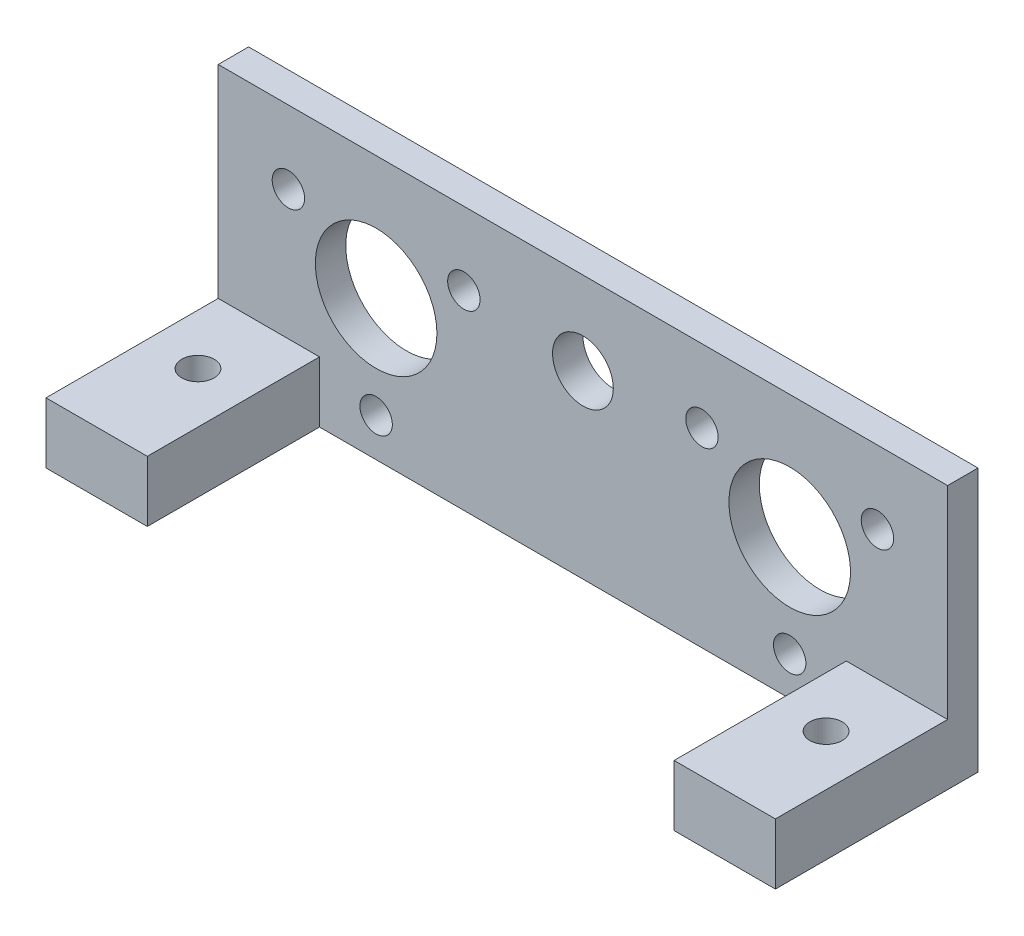
ISO-10303-21;
HEADER;
FILE_DESCRIPTION(('STEP AP214'),'2;1');
FILE_NAME('part.step','',(''),(''),'','','');
FILE_SCHEMA(('AUTOMOTIVE_DESIGN { 1 0 10303 214 1 1 1 1 }'));
ENDSEC;
DATA;
#1=APPLICATION_CONTEXT('core data for automotive mechanical design processes');
#2=APPLICATION_PROTOCOL_DEFINITION('international standard','automotive_design',2000,#1);
#3=PRODUCT_CONTEXT('',#1,'mechanical');
#4=PRODUCT('Part','Part','',(#3));
#5=PRODUCT_RELATED_PRODUCT_CATEGORY('part','',(#4));
#6=PRODUCT_DEFINITION_FORMATION('','',#4);
#7=PRODUCT_DEFINITION_CONTEXT('part definition',#1,'design');
#8=PRODUCT_DEFINITION('design','',#6,#7);
#9=PRODUCT_DEFINITION_SHAPE('','',#8);
#10=(LENGTH_UNIT() NAMED_UNIT(*) SI_UNIT(.MILLI.,.METRE.));
#11=(NAMED_UNIT(*) PLANE_ANGLE_UNIT() SI_UNIT($,.RADIAN.));
#12=(NAMED_UNIT(*) SI_UNIT($,.STERADIAN.) SOLID_ANGLE_UNIT());
#13=UNCERTAINTY_MEASURE_WITH_UNIT(LENGTH_MEASURE(1.E-05),#10,'distance_accuracy_value','');
#14=(GEOMETRIC_REPRESENTATION_CONTEXT(3) GLOBAL_UNCERTAINTY_ASSIGNED_CONTEXT((#13)) GLOBAL_UNIT_ASSIGNED_CONTEXT((#10,
#11,#12)) REPRESENTATION_CONTEXT('',''));
#15=CARTESIAN_POINT('',(0.,0.,0.));
#16=DIRECTION('',(0.,0.,1.));
#17=DIRECTION('',(1.,0.,0.));
#18=AXIS2_PLACEMENT_3D('',#15,#16,#17);
#19=CARTESIAN_POINT('',(-17.9999999961348,4.1,1.5));
#20=DIRECTION('',(0.,0.,-1.));
#21=DIRECTION('',(-1.,0.,0.));
#22=AXIS2_PLACEMENT_3D('',#19,#20,#21);
#23=PLANE('',#22);
#24=CARTESIAN_POINT('',(10.2058806538652,-2.00000000115367,1.5));
#25=DIRECTION('',(0.,0.,1.));
#26=DIRECTION('',(-1.,0.,0.));
#27=AXIS2_PLACEMENT_3D('',#24,#25,#26);
#28=CIRCLE('',#27,2.99999999663328);
#29=CARTESIAN_POINT('',(7.20588065723192,-2.00000000115367,1.5));
#30=VERTEX_POINT('',#29);
#31=EDGE_CURVE('E258',#30,#30,#28,.T.);
#32=ORIENTED_EDGE('',*,*,#31,.F.);
#33=EDGE_LOOP('',(#32));
#34=FACE_BOUND('',#33,.T.);
#35=CARTESIAN_POINT('',(5.87575363564619,0.499999998440345,1.5));
#36=DIRECTION('',(0.,0.,1.));
#37=DIRECTION('',(-1.,0.,0.));
#38=AXIS2_PLACEMENT_3D('',#35,#36,#37);
#39=CIRCLE('',#38,0.799999997424435);
#40=CARTESIAN_POINT('',(5.07575363822175,0.499999998440345,1.5));
#41=VERTEX_POINT('',#40);
#42=EDGE_CURVE('E246',#41,#41,#39,.T.);
#43=ORIENTED_EDGE('',*,*,#42,.F.);
#44=EDGE_LOOP('',(#43));
#45=FACE_BOUND('',#44,.T.);
#46=CARTESIAN_POINT('',(-1.13480579100322E-09,0.,1.5));
#47=DIRECTION('',(0.,0.,1.));
#48=DIRECTION('',(1.,0.,0.));
#49=AXIS2_PLACEMENT_3D('',#46,#47,#48);
#50=CIRCLE('',#49,1.50000000050074);
#51=CARTESIAN_POINT('',(1.49999999936594,0.,1.5));
#52=VERTEX_POINT('',#51);
#53=EDGE_CURVE('E234',#52,#52,#50,.T.);
#54=ORIENTED_EDGE('',*,*,#53,.F.);
#55=EDGE_LOOP('',(#54));
#56=FACE_BOUND('',#55,.T.);
#57=CARTESIAN_POINT('',(-5.8757536379158,0.499999998440343,1.5));
#58=DIRECTION('',(0.,0.,1.));
#59=DIRECTION('',(1.,0.,0.));
#60=AXIS2_PLACEMENT_3D('',#57,#58,#59);
#61=CIRCLE('',#60,0.799999999594875);
#62=CARTESIAN_POINT('',(-5.07575363832092,0.499999998440343,1.5));
#63=VERTEX_POINT('',#62);
#64=EDGE_CURVE('E222',#63,#63,#61,.T.);
#65=ORIENTED_EDGE('',*,*,#64,.F.);
#66=EDGE_LOOP('',(#65));
#67=FACE_BOUND('',#66,.T.);
#68=CARTESIAN_POINT('',(-10.2058806561348,-2.00000000115367,1.5));
#69=DIRECTION('',(0.,0.,1.));
#70=DIRECTION('',(1.,0.,0.));
#71=AXIS2_PLACEMENT_3D('',#68,#69,#70);
#72=CIRCLE('',#71,2.99999999880372);
#73=CARTESIAN_POINT('',(-7.20588065733109,-2.00000000115367,1.5));
#74=VERTEX_POINT('',#73);
#75=EDGE_CURVE('E184',#74,#74,#72,.T.);
#76=ORIENTED_EDGE('',*,*,#75,.F.);
#77=EDGE_LOOP('',(#76));
#78=FACE_BOUND('',#77,.T.);
#79=CARTESIAN_POINT('',(-14.5360076767593,0.499999999829146,1.5));
#80=DIRECTION('',(0.,0.,1.));
#81=DIRECTION('',(1.,0.,0.));
#82=AXIS2_PLACEMENT_3D('',#79,#80,#81);
#83=CIRCLE('',#82,0.800000000144266);
#84=CARTESIAN_POINT('',(-13.736007676615,0.499999999829146,1.5));
#85=VERTEX_POINT('',#84);
#86=EDGE_CURVE('E216',#85,#85,#83,.T.);
#87=ORIENTED_EDGE('',*,*,#86,.F.);
#88=EDGE_LOOP('',(#87));
#89=FACE_BOUND('',#88,.T.);
#90=CARTESIAN_POINT('',(-10.2058806561348,-7.00000000115368,1.5));
#91=DIRECTION('',(0.,0.,1.));
#92=DIRECTION('',(1.,0.,0.));
#93=AXIS2_PLACEMENT_3D('',#90,#91,#92);
#94=CIRCLE('',#93,0.799999998803722);
#95=CARTESIAN_POINT('',(-9.40588065733109,-7.00000000115368,1.5));
#96=VERTEX_POINT('',#95);
#97=EDGE_CURVE('E228',#96,#96,#94,.T.);
#98=ORIENTED_EDGE('',*,*,#97,.F.);
#99=EDGE_LOOP('',(#98));
#100=FACE_BOUND('',#99,.T.);
#101=CARTESIAN_POINT('',(10.2058806538652,-7.00000000115367,1.5));
#102=DIRECTION('',(0.,0.,1.));
#103=DIRECTION('',(-1.,0.,0.));
#104=AXIS2_PLACEMENT_3D('',#101,#102,#103);
#105=CIRCLE('',#104,0.799999996633277);
#106=CARTESIAN_POINT('',(9.40588065723192,-7.00000000115367,1.5));
#107=VERTEX_POINT('',#106);
#108=EDGE_CURVE('E240',#107,#107,#105,.T.);
#109=ORIENTED_EDGE('',*,*,#108,.F.);
#110=EDGE_LOOP('',(#109));
#111=FACE_BOUND('',#110,.T.);
#112=CARTESIAN_POINT('',(14.5360076744897,0.499999999829149,1.5));
#113=DIRECTION('',(0.,0.,1.));
#114=DIRECTION('',(-1.,0.,0.));
#115=AXIS2_PLACEMENT_3D('',#112,#113,#114);
#116=CIRCLE('',#115,0.799999997973823);
#117=CARTESIAN_POINT('',(13.7360076765159,0.499999999829149,1.5));
#118=VERTEX_POINT('',#117);
#119=EDGE_CURVE('E252',#118,#118,#116,.T.);
#120=ORIENTED_EDGE('',*,*,#119,.F.);
#121=EDGE_LOOP('',(#120));
#122=FACE_BOUND('',#121,.T.);
#123=DIRECTION('',(0.,1.,0.));
#124=VECTOR('',#123,1.);
#125=CARTESIAN_POINT('',(-12.9999999961348,-32.3126322749151,1.5));
#126=LINE('',#125,#124);
#127=CARTESIAN_POINT('',(-12.9999999961348,-8.9,1.5));
#128=VERTEX_POINT('',#127);
#129=CARTESIAN_POINT('',(-12.9999999961348,-5.9,1.5));
#130=VERTEX_POINT('',#129);
#131=EDGE_CURVE('E286',#128,#130,#126,.T.);
#132=ORIENTED_EDGE('',*,*,#131,.F.);
#133=DIRECTION('',(1.,0.,0.));
#134=VECTOR('',#133,1.);
#135=CARTESIAN_POINT('',(-17.9999999961348,-8.9,1.5));
#136=LINE('',#135,#134);
#137=CARTESIAN_POINT('',(12.9999999961348,-8.9,1.5));
#138=VERTEX_POINT('',#137);
#139=EDGE_CURVE('E35',#128,#138,#136,.T.);
#140=ORIENTED_EDGE('',*,*,#139,.T.);
#141=DIRECTION('',(0.,1.,0.));
#142=VECTOR('',#141,1.);
#143=CARTESIAN_POINT('',(12.9999999961348,-32.3126322749151,1.5));
#144=LINE('',#143,#142);
#145=CARTESIAN_POINT('',(12.9999999961348,-5.90000000000001,1.5));
#146=VERTEX_POINT('',#145);
#147=EDGE_CURVE('E136',#138,#146,#144,.T.);
#148=ORIENTED_EDGE('',*,*,#147,.T.);
#149=DIRECTION('',(-1.,0.,0.));
#150=VECTOR('',#149,1.);
#151=CARTESIAN_POINT('',(-1.13480399455416E-09,-5.90000000000001,1.5));
#152=LINE('',#151,#150);
#153=CARTESIAN_POINT('',(17.9999999938652,-5.9,1.5));
#154=VERTEX_POINT('',#153);
#155=EDGE_CURVE('E133',#154,#146,#152,.T.);
#156=ORIENTED_EDGE('',*,*,#155,.F.);
#157=DIRECTION('',(0.,1.,0.));
#158=VECTOR('',#157,1.);
#159=CARTESIAN_POINT('',(17.9999999938652,4.1,1.5));
#160=LINE('',#159,#158);
#161=CARTESIAN_POINT('',(17.9999999938652,4.1,1.5));
#162=VERTEX_POINT('',#161);
#163=EDGE_CURVE('E170',#154,#162,#160,.T.);
#164=ORIENTED_EDGE('',*,*,#163,.T.);
#165=DIRECTION('',(-1.,0.,0.));
#166=VECTOR('',#165,1.);
#167=CARTESIAN_POINT('',(-17.9999999961348,4.1,1.5));
#168=LINE('',#167,#166);
#169=CARTESIAN_POINT('',(-17.9999999961348,4.1,1.5));
#170=VERTEX_POINT('',#169);
#171=EDGE_CURVE('E172',#162,#170,#168,.T.);
#172=ORIENTED_EDGE('',*,*,#171,.T.);
#173=DIRECTION('',(0.,-1.,0.));
#174=VECTOR('',#173,1.);
#175=CARTESIAN_POINT('',(-17.9999999961348,-8.9,1.5));
#176=LINE('',#175,#174);
#177=CARTESIAN_POINT('',(-17.9999999961348,-5.9,1.5));
#178=VERTEX_POINT('',#177);
#179=EDGE_CURVE('E54',#170,#178,#176,.T.);
#180=ORIENTED_EDGE('',*,*,#179,.T.);
#181=DIRECTION('',(1.,0.,0.));
#182=VECTOR('',#181,1.);
#183=CARTESIAN_POINT('',(-1.13479483083151E-09,-5.90000000000001,1.5));
#184=LINE('',#183,#182);
#185=EDGE_CURVE('E49',#178,#130,#184,.T.);
#186=ORIENTED_EDGE('',*,*,#185,.T.);
#187=EDGE_LOOP('',(#132,#140,#148,#156,#164,#172,#180,#186));
#188=FACE_BOUND('',#187,.T.);
#189=ADVANCED_FACE('F31',(#34,#45,#56,#67,#78,#89,#100,#111,#122,#188),#23,.F.);
#190=CARTESIAN_POINT('',(-17.9999999961348,4.1,0.));
#191=DIRECTION('',(0.,0.,-1.));
#192=DIRECTION('',(-1.,0.,0.));
#193=AXIS2_PLACEMENT_3D('',#190,#191,#192);
#194=PLANE('',#193);
#195=CARTESIAN_POINT('',(14.5360076744897,0.499999999829149,0.));
#196=DIRECTION('',(0.,0.,1.));
#197=DIRECTION('',(-1.,0.,0.));
#198=AXIS2_PLACEMENT_3D('',#195,#196,#197);
#199=CIRCLE('',#198,0.799999997973823);
#200=CARTESIAN_POINT('',(13.7360076765159,0.499999999829149,0.));
#201=VERTEX_POINT('',#200);
#202=EDGE_CURVE('E255',#201,#201,#199,.T.);
#203=ORIENTED_EDGE('',*,*,#202,.T.);
#204=EDGE_LOOP('',(#203));
#205=FACE_BOUND('',#204,.T.);
#206=CARTESIAN_POINT('',(10.2058806538652,-7.00000000115367,0.));
#207=DIRECTION('',(0.,0.,1.));
#208=DIRECTION('',(-1.,0.,0.));
#209=AXIS2_PLACEMENT_3D('',#206,#207,#208);
#210=CIRCLE('',#209,0.799999996633277);
#211=CARTESIAN_POINT('',(9.40588065723192,-7.00000000115367,0.));
#212=VERTEX_POINT('',#211);
#213=EDGE_CURVE('E243',#212,#212,#210,.T.);
#214=ORIENTED_EDGE('',*,*,#213,.T.);
#215=EDGE_LOOP('',(#214));
#216=FACE_BOUND('',#215,.T.);
#217=CARTESIAN_POINT('',(-10.2058806561348,-7.00000000115368,0.));
#218=DIRECTION('',(0.,0.,1.));
#219=DIRECTION('',(1.,0.,0.));
#220=AXIS2_PLACEMENT_3D('',#217,#218,#219);
#221=CIRCLE('',#220,0.799999998803722);
#222=CARTESIAN_POINT('',(-9.40588065733109,-7.00000000115368,0.));
#223=VERTEX_POINT('',#222);
#224=EDGE_CURVE('E231',#223,#223,#221,.T.);
#225=ORIENTED_EDGE('',*,*,#224,.T.);
#226=EDGE_LOOP('',(#225));
#227=FACE_BOUND('',#226,.T.);
#228=CARTESIAN_POINT('',(-14.5360076767593,0.499999999829146,0.));
#229=DIRECTION('',(0.,0.,1.));
#230=DIRECTION('',(1.,0.,0.));
#231=AXIS2_PLACEMENT_3D('',#228,#229,#230);
#232=CIRCLE('',#231,0.800000000144266);
#233=CARTESIAN_POINT('',(-13.736007676615,0.499999999829146,0.));
#234=VERTEX_POINT('',#233);
#235=EDGE_CURVE('E219',#234,#234,#232,.T.);
#236=ORIENTED_EDGE('',*,*,#235,.T.);
#237=EDGE_LOOP('',(#236));
#238=FACE_BOUND('',#237,.T.);
#239=DIRECTION('',(0.,-1.,0.));
#240=VECTOR('',#239,1.);
#241=CARTESIAN_POINT('',(-17.9999999961348,-8.9,0.));
#242=LINE('',#241,#240);
#243=CARTESIAN_POINT('',(-17.9999999961348,4.1,0.));
#244=VERTEX_POINT('',#243);
#245=CARTESIAN_POINT('',(-17.9999999961348,-8.9,0.));
#246=VERTEX_POINT('',#245);
#247=EDGE_CURVE('E180',#244,#246,#242,.T.);
#248=ORIENTED_EDGE('',*,*,#247,.F.);
#249=DIRECTION('',(-1.,0.,0.));
#250=VECTOR('',#249,1.);
#251=CARTESIAN_POINT('',(-17.9999999961348,4.1,0.));
#252=LINE('',#251,#250);
#253=CARTESIAN_POINT('',(17.9999999938652,4.1,0.));
#254=VERTEX_POINT('',#253);
#255=EDGE_CURVE('E188',#254,#244,#252,.T.);
#256=ORIENTED_EDGE('',*,*,#255,.F.);
#257=DIRECTION('',(0.,1.,0.));
#258=VECTOR('',#257,1.);
#259=CARTESIAN_POINT('',(17.9999999938652,4.1,0.));
#260=LINE('',#259,#258);
#261=CARTESIAN_POINT('',(17.9999999938652,-8.89999999999999,0.));
#262=VERTEX_POINT('',#261);
#263=EDGE_CURVE('E186',#262,#254,#260,.T.);
#264=ORIENTED_EDGE('',*,*,#263,.F.);
#265=DIRECTION('',(1.,0.,0.));
#266=VECTOR('',#265,1.);
#267=CARTESIAN_POINT('',(-17.9999999961348,-8.9,0.));
#268=LINE('',#267,#266);
#269=EDGE_CURVE('E183',#246,#262,#268,.T.);
#270=ORIENTED_EDGE('',*,*,#269,.F.);
#271=EDGE_LOOP('',(#248,#256,#264,#270));
#272=FACE_BOUND('',#271,.T.);
#273=CARTESIAN_POINT('',(-10.2058806561348,-2.00000000115367,0.));
#274=DIRECTION('',(0.,0.,1.));
#275=DIRECTION('',(1.,0.,0.));
#276=AXIS2_PLACEMENT_3D('',#273,#274,#275);
#277=CIRCLE('',#276,2.99999999880372);
#278=CARTESIAN_POINT('',(-7.20588065733109,-2.00000000115367,0.));
#279=VERTEX_POINT('',#278);
#280=EDGE_CURVE('E213',#279,#279,#277,.T.);
#281=ORIENTED_EDGE('',*,*,#280,.T.);
#282=EDGE_LOOP('',(#281));
#283=FACE_BOUND('',#282,.T.);
#284=CARTESIAN_POINT('',(-5.8757536379158,0.499999998440343,0.));
#285=DIRECTION('',(0.,0.,1.));
#286=DIRECTION('',(1.,0.,0.));
#287=AXIS2_PLACEMENT_3D('',#284,#285,#286);
#288=CIRCLE('',#287,0.799999999594875);
#289=CARTESIAN_POINT('',(-5.07575363832092,0.499999998440343,0.));
#290=VERTEX_POINT('',#289);
#291=EDGE_CURVE('E225',#290,#290,#288,.T.);
#292=ORIENTED_EDGE('',*,*,#291,.T.);
#293=EDGE_LOOP('',(#292));
#294=FACE_BOUND('',#293,.T.);
#295=CARTESIAN_POINT('',(-1.13480579100322E-09,0.,0.));
#296=DIRECTION('',(0.,0.,1.));
#297=DIRECTION('',(1.,0.,0.));
#298=AXIS2_PLACEMENT_3D('',#295,#296,#297);
#299=CIRCLE('',#298,1.50000000050074);
#300=CARTESIAN_POINT('',(1.49999999936594,0.,0.));
#301=VERTEX_POINT('',#300);
#302=EDGE_CURVE('E237',#301,#301,#299,.T.);
#303=ORIENTED_EDGE('',*,*,#302,.T.);
#304=EDGE_LOOP('',(#303));
#305=FACE_BOUND('',#304,.T.);
#306=CARTESIAN_POINT('',(5.87575363564619,0.499999998440345,0.));
#307=DIRECTION('',(0.,0.,1.));
#308=DIRECTION('',(-1.,0.,0.));
#309=AXIS2_PLACEMENT_3D('',#306,#307,#308);
#310=CIRCLE('',#309,0.799999997424435);
#311=CARTESIAN_POINT('',(5.07575363822175,0.499999998440345,0.));
#312=VERTEX_POINT('',#311);
#313=EDGE_CURVE('E249',#312,#312,#310,.T.);
#314=ORIENTED_EDGE('',*,*,#313,.T.);
#315=EDGE_LOOP('',(#314));
#316=FACE_BOUND('',#315,.T.);
#317=CARTESIAN_POINT('',(10.2058806538652,-2.00000000115367,0.));
#318=DIRECTION('',(0.,0.,1.));
#319=DIRECTION('',(-1.,0.,0.));
#320=AXIS2_PLACEMENT_3D('',#317,#318,#319);
#321=CIRCLE('',#320,2.99999999663328);
#322=CARTESIAN_POINT('',(7.20588065723192,-2.00000000115367,0.));
#323=VERTEX_POINT('',#322);
#324=EDGE_CURVE('E167',#323,#323,#321,.T.);
#325=ORIENTED_EDGE('',*,*,#324,.T.);
#326=EDGE_LOOP('',(#325));
#327=FACE_BOUND('',#326,.T.);
#328=ADVANCED_FACE('F205',(#205,#216,#227,#238,#272,#283,#294,#305,#316,#327),#194,.T.);
#329=CARTESIAN_POINT('',(-17.9999999961348,-8.9,1.5));
#330=DIRECTION('',(1.,0.,0.));
#331=DIRECTION('',(0.,0.,-1.));
#332=AXIS2_PLACEMENT_3D('',#329,#330,#331);
#333=PLANE('',#332);
#334=ORIENTED_EDGE('',*,*,#247,.T.);
#335=DIRECTION('',(0.,0.,-1.));
#336=VECTOR('',#335,1.);
#337=CARTESIAN_POINT('',(-17.9999999961348,-8.9,1.5));
#338=LINE('',#337,#336);
#339=CARTESIAN_POINT('',(-17.9999999961348,-8.9,10.));
#340=VERTEX_POINT('',#339);
#341=EDGE_CURVE('E11',#340,#246,#338,.T.);
#342=ORIENTED_EDGE('',*,*,#341,.F.);
#343=DIRECTION('',(0.,-1.,0.));
#344=VECTOR('',#343,1.);
#345=CARTESIAN_POINT('',(-17.9999999961348,-32.3126322749151,10.));
#346=LINE('',#345,#344);
#347=CARTESIAN_POINT('',(-17.9999999961348,-5.9,10.));
#348=VERTEX_POINT('',#347);
#349=EDGE_CURVE('E128',#348,#340,#346,.T.);
#350=ORIENTED_EDGE('',*,*,#349,.F.);
#351=DIRECTION('',(0.,0.,-1.));
#352=VECTOR('',#351,1.);
#353=CARTESIAN_POINT('',(-17.9999999961348,-5.9,10.));
#354=LINE('',#353,#352);
#355=EDGE_CURVE('E138',#348,#178,#354,.T.);
#356=ORIENTED_EDGE('',*,*,#355,.T.);
#357=ORIENTED_EDGE('',*,*,#179,.F.);
#358=DIRECTION('',(0.,0.,-1.));
#359=VECTOR('',#358,1.);
#360=CARTESIAN_POINT('',(-17.9999999961348,4.1,1.5));
#361=LINE('',#360,#359);
#362=EDGE_CURVE('E179',#170,#244,#361,.T.);
#363=ORIENTED_EDGE('',*,*,#362,.T.);
#364=EDGE_LOOP('',(#334,#342,#350,#356,#357,#363));
#365=FACE_BOUND('',#364,.T.);
#366=ADVANCED_FACE('F33',(#365),#333,.F.);
#367=CARTESIAN_POINT('',(-17.9999999961348,-8.9,1.5));
#368=DIRECTION('',(0.,1.,0.));
#369=DIRECTION('',(-1.,0.,0.));
#370=AXIS2_PLACEMENT_3D('',#367,#368,#369);
#371=PLANE('',#370);
#372=CARTESIAN_POINT('',(-15.4999999961348,-8.90000000000001,5.));
#373=DIRECTION('',(0.,-1.,0.));
#374=DIRECTION('',(0.,0.,-1.));
#375=AXIS2_PLACEMENT_3D('',#372,#373,#374);
#376=CIRCLE('',#375,0.799999999999988);
#377=CARTESIAN_POINT('',(-15.4999999961348,-8.90000000000001,4.20000000000001));
#378=VERTEX_POINT('',#377);
#379=EDGE_CURVE('E302',#378,#378,#376,.T.);
#380=ORIENTED_EDGE('',*,*,#379,.F.);
#381=EDGE_LOOP('',(#380));
#382=FACE_BOUND('',#381,.T.);
#383=CARTESIAN_POINT('',(15.499999995,-8.9,5.));
#384=DIRECTION('',(0.,-1.,0.));
#385=DIRECTION('',(0.,0.,-1.));
#386=AXIS2_PLACEMENT_3D('',#383,#384,#385);
#387=CIRCLE('',#386,0.799999999999988);
#388=CARTESIAN_POINT('',(15.499999995,-8.9,4.20000000000001));
#389=VERTEX_POINT('',#388);
#390=EDGE_CURVE('E291',#389,#389,#387,.T.);
#391=ORIENTED_EDGE('',*,*,#390,.F.);
#392=EDGE_LOOP('',(#391));
#393=FACE_BOUND('',#392,.T.);
#394=ORIENTED_EDGE('',*,*,#269,.T.);
#395=DIRECTION('',(0.,0.,-1.));
#396=VECTOR('',#395,1.);
#397=CARTESIAN_POINT('',(17.9999999938652,-8.89999999999999,1.5));
#398=LINE('',#397,#396);
#399=CARTESIAN_POINT('',(17.9999999938652,-8.89999999999999,10.));
#400=VERTEX_POINT('',#399);
#401=EDGE_CURVE('E41',#400,#262,#398,.T.);
#402=ORIENTED_EDGE('',*,*,#401,.F.);
#403=DIRECTION('',(1.,0.,0.));
#404=VECTOR('',#403,1.);
#405=CARTESIAN_POINT('',(-1.13480618176665E-09,-8.9,10.));
#406=LINE('',#405,#404);
#407=CARTESIAN_POINT('',(12.9999999961348,-8.9,10.));
#408=VERTEX_POINT('',#407);
#409=EDGE_CURVE('E150',#408,#400,#406,.T.);
#410=ORIENTED_EDGE('',*,*,#409,.F.);
#411=DIRECTION('',(0.,0.,-1.));
#412=VECTOR('',#411,1.);
#413=CARTESIAN_POINT('',(12.9999999961348,-8.9,10.));
#414=LINE('',#413,#412);
#415=EDGE_CURVE('E153',#408,#138,#414,.T.);
#416=ORIENTED_EDGE('',*,*,#415,.T.);
#417=ORIENTED_EDGE('',*,*,#139,.F.);
#418=DIRECTION('',(0.,0.,-1.));
#419=VECTOR('',#418,1.);
#420=CARTESIAN_POINT('',(-12.9999999961348,-8.9,10.));
#421=LINE('',#420,#419);
#422=CARTESIAN_POINT('',(-12.9999999961348,-8.9,10.));
#423=VERTEX_POINT('',#422);
#424=EDGE_CURVE('E116',#423,#128,#421,.T.);
#425=ORIENTED_EDGE('',*,*,#424,.F.);
#426=DIRECTION('',(1.,0.,0.));
#427=VECTOR('',#426,1.);
#428=CARTESIAN_POINT('',(-1.13480618176665E-09,-8.9,10.));
#429=LINE('',#428,#427);
#430=EDGE_CURVE('E122',#340,#423,#429,.T.);
#431=ORIENTED_EDGE('',*,*,#430,.F.);
#432=ORIENTED_EDGE('',*,*,#341,.T.);
#433=EDGE_LOOP('',(#394,#402,#410,#416,#417,#425,#431,#432));
#434=FACE_BOUND('',#433,.T.);
#435=ADVANCED_FACE('F131',(#382,#393,#434),#371,.F.);
#436=CARTESIAN_POINT('',(17.9999999938652,4.1,1.5));
#437=DIRECTION('',(-1.,0.,0.));
#438=DIRECTION('',(0.,-1.,0.));
#439=AXIS2_PLACEMENT_3D('',#436,#437,#438);
#440=PLANE('',#439);
#441=ORIENTED_EDGE('',*,*,#263,.T.);
#442=DIRECTION('',(0.,0.,-1.));
#443=VECTOR('',#442,1.);
#444=CARTESIAN_POINT('',(17.9999999938652,4.1,1.5));
#445=LINE('',#444,#443);
#446=EDGE_CURVE('E192',#162,#254,#445,.T.);
#447=ORIENTED_EDGE('',*,*,#446,.F.);
#448=ORIENTED_EDGE('',*,*,#163,.F.);
#449=DIRECTION('',(0.,0.,-1.));
#450=VECTOR('',#449,1.);
#451=CARTESIAN_POINT('',(17.9999999938652,-5.9,10.));
#452=LINE('',#451,#450);
#453=CARTESIAN_POINT('',(17.9999999938652,-5.9,10.));
#454=VERTEX_POINT('',#453);
#455=EDGE_CURVE('E164',#454,#154,#452,.T.);
#456=ORIENTED_EDGE('',*,*,#455,.F.);
#457=DIRECTION('',(0.,1.,0.));
#458=VECTOR('',#457,1.);
#459=CARTESIAN_POINT('',(17.9999999938652,-32.3126322749151,10.));
#460=LINE('',#459,#458);
#461=EDGE_CURVE('E142',#400,#454,#460,.T.);
#462=ORIENTED_EDGE('',*,*,#461,.F.);
#463=ORIENTED_EDGE('',*,*,#401,.T.);
#464=EDGE_LOOP('',(#441,#447,#448,#456,#462,#463));
#465=FACE_BOUND('',#464,.T.);
#466=ADVANCED_FACE('F198',(#465),#440,.F.);
#467=CARTESIAN_POINT('',(-17.9999999961348,4.1,1.5));
#468=DIRECTION('',(0.,-1.,0.));
#469=DIRECTION('',(0.,0.,-1.));
#470=AXIS2_PLACEMENT_3D('',#467,#468,#469);
#471=PLANE('',#470);
#472=ORIENTED_EDGE('',*,*,#255,.T.);
#473=ORIENTED_EDGE('',*,*,#362,.F.);
#474=ORIENTED_EDGE('',*,*,#171,.F.);
#475=ORIENTED_EDGE('',*,*,#446,.T.);
#476=EDGE_LOOP('',(#472,#473,#474,#475));
#477=FACE_BOUND('',#476,.T.);
#478=ADVANCED_FACE('F209',(#477),#471,.F.);
#479=CARTESIAN_POINT('',(-10.2058806561348,-2.00000000115367,1.5));
#480=DIRECTION('',(0.,0.,-1.));
#481=DIRECTION('',(-1.,0.,0.));
#482=AXIS2_PLACEMENT_3D('',#479,#480,#481);
#483=CYLINDRICAL_SURFACE('',#482,2.99999999880372);
#484=ORIENTED_EDGE('',*,*,#75,.T.);
#485=EDGE_LOOP('',(#484));
#486=FACE_BOUND('',#485,.T.);
#487=ORIENTED_EDGE('',*,*,#280,.F.);
#488=EDGE_LOOP('',(#487));
#489=FACE_BOUND('',#488,.T.);
#490=ADVANCED_FACE('F372',(#486,#489),#483,.F.);
#491=CARTESIAN_POINT('',(-14.5360076767593,0.499999999829146,1.5));
#492=DIRECTION('',(0.,0.,-1.));
#493=DIRECTION('',(-1.,0.,0.));
#494=AXIS2_PLACEMENT_3D('',#491,#492,#493);
#495=CYLINDRICAL_SURFACE('',#494,0.800000000144266);
#496=ORIENTED_EDGE('',*,*,#86,.T.);
#497=EDGE_LOOP('',(#496));
#498=FACE_BOUND('',#497,.T.);
#499=ORIENTED_EDGE('',*,*,#235,.F.);
#500=EDGE_LOOP('',(#499));
#501=FACE_BOUND('',#500,.T.);
#502=ADVANCED_FACE('F368',(#498,#501),#495,.F.);
#503=CARTESIAN_POINT('',(-5.8757536379158,0.499999998440343,1.5));
#504=DIRECTION('',(0.,0.,-1.));
#505=DIRECTION('',(-1.,0.,0.));
#506=AXIS2_PLACEMENT_3D('',#503,#504,#505);
#507=CYLINDRICAL_SURFACE('',#506,0.799999999594875);
#508=ORIENTED_EDGE('',*,*,#64,.T.);
#509=EDGE_LOOP('',(#508));
#510=FACE_BOUND('',#509,.T.);
#511=ORIENTED_EDGE('',*,*,#291,.F.);
#512=EDGE_LOOP('',(#511));
#513=FACE_BOUND('',#512,.T.);
#514=ADVANCED_FACE('F364',(#510,#513),#507,.F.);
#515=CARTESIAN_POINT('',(-10.2058806561348,-7.00000000115368,1.5));
#516=DIRECTION('',(0.,0.,-1.));
#517=DIRECTION('',(-1.,0.,0.));
#518=AXIS2_PLACEMENT_3D('',#515,#516,#517);
#519=CYLINDRICAL_SURFACE('',#518,0.799999998803722);
#520=ORIENTED_EDGE('',*,*,#97,.T.);
#521=EDGE_LOOP('',(#520));
#522=FACE_BOUND('',#521,.T.);
#523=ORIENTED_EDGE('',*,*,#224,.F.);
#524=EDGE_LOOP('',(#523));
#525=FACE_BOUND('',#524,.T.);
#526=ADVANCED_FACE('F360',(#522,#525),#519,.F.);
#527=CARTESIAN_POINT('',(-1.13480579100322E-09,0.,1.5));
#528=DIRECTION('',(0.,0.,-1.));
#529=DIRECTION('',(-1.,0.,0.));
#530=AXIS2_PLACEMENT_3D('',#527,#528,#529);
#531=CYLINDRICAL_SURFACE('',#530,1.50000000050074);
#532=ORIENTED_EDGE('',*,*,#53,.T.);
#533=EDGE_LOOP('',(#532));
#534=FACE_BOUND('',#533,.T.);
#535=ORIENTED_EDGE('',*,*,#302,.F.);
#536=EDGE_LOOP('',(#535));
#537=FACE_BOUND('',#536,.T.);
#538=ADVANCED_FACE('F356',(#534,#537),#531,.F.);
#539=CARTESIAN_POINT('',(10.2058806538652,-7.00000000115367,1.5));
#540=DIRECTION('',(0.,0.,-1.));
#541=DIRECTION('',(-1.,0.,0.));
#542=AXIS2_PLACEMENT_3D('',#539,#540,#541);
#543=CYLINDRICAL_SURFACE('',#542,0.799999996633277);
#544=ORIENTED_EDGE('',*,*,#108,.T.);
#545=EDGE_LOOP('',(#544));
#546=FACE_BOUND('',#545,.T.);
#547=ORIENTED_EDGE('',*,*,#213,.F.);
#548=EDGE_LOOP('',(#547));
#549=FACE_BOUND('',#548,.T.);
#550=ADVANCED_FACE('F352',(#546,#549),#543,.F.);
#551=CARTESIAN_POINT('',(5.87575363564619,0.499999998440345,1.5));
#552=DIRECTION('',(0.,0.,-1.));
#553=DIRECTION('',(-1.,0.,0.));
#554=AXIS2_PLACEMENT_3D('',#551,#552,#553);
#555=CYLINDRICAL_SURFACE('',#554,0.799999997424435);
#556=ORIENTED_EDGE('',*,*,#42,.T.);
#557=EDGE_LOOP('',(#556));
#558=FACE_BOUND('',#557,.T.);
#559=ORIENTED_EDGE('',*,*,#313,.F.);
#560=EDGE_LOOP('',(#559));
#561=FACE_BOUND('',#560,.T.);
#562=ADVANCED_FACE('F348',(#558,#561),#555,.F.);
#563=CARTESIAN_POINT('',(14.5360076744897,0.499999999829149,1.5));
#564=DIRECTION('',(0.,0.,-1.));
#565=DIRECTION('',(-1.,0.,0.));
#566=AXIS2_PLACEMENT_3D('',#563,#564,#565);
#567=CYLINDRICAL_SURFACE('',#566,0.799999997973823);
#568=ORIENTED_EDGE('',*,*,#119,.T.);
#569=EDGE_LOOP('',(#568));
#570=FACE_BOUND('',#569,.T.);
#571=ORIENTED_EDGE('',*,*,#202,.F.);
#572=EDGE_LOOP('',(#571));
#573=FACE_BOUND('',#572,.T.);
#574=ADVANCED_FACE('F345',(#570,#573),#567,.F.);
#575=CARTESIAN_POINT('',(10.2058806538652,-2.00000000115367,1.5));
#576=DIRECTION('',(0.,0.,-1.));
#577=DIRECTION('',(-1.,0.,0.));
#578=AXIS2_PLACEMENT_3D('',#575,#576,#577);
#579=CYLINDRICAL_SURFACE('',#578,2.99999999663328);
#580=ORIENTED_EDGE('',*,*,#31,.T.);
#581=EDGE_LOOP('',(#580));
#582=FACE_BOUND('',#581,.T.);
#583=ORIENTED_EDGE('',*,*,#324,.F.);
#584=EDGE_LOOP('',(#583));
#585=FACE_BOUND('',#584,.T.);
#586=ADVANCED_FACE('F265',(#582,#585),#579,.F.);
#587=CARTESIAN_POINT('',(-1.13480399455416E-09,-5.90000000000001,10.));
#588=DIRECTION('',(0.,-1.,0.));
#589=DIRECTION('',(1.,0.,0.));
#590=AXIS2_PLACEMENT_3D('',#587,#588,#589);
#591=PLANE('',#590);
#592=CARTESIAN_POINT('',(15.499999995,-5.9,5.));
#593=DIRECTION('',(0.,-1.,0.));
#594=DIRECTION('',(1.,0.,0.));
#595=AXIS2_PLACEMENT_3D('',#592,#593,#594);
#596=CIRCLE('',#595,0.799999999999993);
#597=CARTESIAN_POINT('',(16.299999995,-5.9,5.));
#598=VERTEX_POINT('',#597);
#599=EDGE_CURVE('E287',#598,#598,#596,.T.);
#600=ORIENTED_EDGE('',*,*,#599,.T.);
#601=EDGE_LOOP('',(#600));
#602=FACE_BOUND('',#601,.T.);
#603=ORIENTED_EDGE('',*,*,#155,.T.);
#604=DIRECTION('',(0.,0.,-1.));
#605=VECTOR('',#604,1.);
#606=CARTESIAN_POINT('',(12.9999999961348,-5.90000000000001,10.));
#607=LINE('',#606,#605);
#608=CARTESIAN_POINT('',(12.9999999961348,-5.90000000000001,10.));
#609=VERTEX_POINT('',#608);
#610=EDGE_CURVE('E156',#609,#146,#607,.T.);
#611=ORIENTED_EDGE('',*,*,#610,.F.);
#612=DIRECTION('',(-1.,0.,0.));
#613=VECTOR('',#612,1.);
#614=CARTESIAN_POINT('',(-1.13480399455416E-09,-5.90000000000001,10.));
#615=LINE('',#614,#613);
#616=EDGE_CURVE('E145',#454,#609,#615,.T.);
#617=ORIENTED_EDGE('',*,*,#616,.F.);
#618=ORIENTED_EDGE('',*,*,#455,.T.);
#619=EDGE_LOOP('',(#603,#611,#617,#618));
#620=FACE_BOUND('',#619,.T.);
#621=ADVANCED_FACE('F338',(#602,#620),#591,.F.);
#622=CARTESIAN_POINT('',(12.9999999961348,-32.3126322749151,10.));
#623=DIRECTION('',(-1.,0.,0.));
#624=DIRECTION('',(0.,0.,1.));
#625=AXIS2_PLACEMENT_3D('',#622,#623,#624);
#626=PLANE('',#625);
#627=ORIENTED_EDGE('',*,*,#147,.F.);
#628=ORIENTED_EDGE('',*,*,#415,.F.);
#629=DIRECTION('',(0.,1.,0.));
#630=VECTOR('',#629,1.);
#631=CARTESIAN_POINT('',(12.9999999961348,-32.3126322749151,10.));
#632=LINE('',#631,#630);
#633=EDGE_CURVE('E147',#408,#609,#632,.T.);
#634=ORIENTED_EDGE('',*,*,#633,.T.);
#635=ORIENTED_EDGE('',*,*,#610,.T.);
#636=EDGE_LOOP('',(#627,#628,#634,#635));
#637=FACE_BOUND('',#636,.T.);
#638=ADVANCED_FACE('F334',(#637),#626,.T.);
#639=CARTESIAN_POINT('',(-1.13479941269284E-09,-32.3126322749151,10.));
#640=DIRECTION('',(0.,0.,1.));
#641=DIRECTION('',(1.,0.,0.));
#642=AXIS2_PLACEMENT_3D('',#639,#640,#641);
#643=PLANE('',#642);
#644=ORIENTED_EDGE('',*,*,#461,.T.);
#645=ORIENTED_EDGE('',*,*,#616,.T.);
#646=ORIENTED_EDGE('',*,*,#633,.F.);
#647=ORIENTED_EDGE('',*,*,#409,.T.);
#648=EDGE_LOOP('',(#644,#645,#646,#647));
#649=FACE_BOUND('',#648,.T.);
#650=ADVANCED_FACE('F331',(#649),#643,.T.);
#651=CARTESIAN_POINT('',(-12.9999999961348,-32.3126322749151,10.));
#652=DIRECTION('',(-1.,0.,0.));
#653=DIRECTION('',(0.,0.,1.));
#654=AXIS2_PLACEMENT_3D('',#651,#652,#653);
#655=PLANE('',#654);
#656=ORIENTED_EDGE('',*,*,#131,.T.);
#657=DIRECTION('',(0.,0.,-1.));
#658=VECTOR('',#657,1.);
#659=CARTESIAN_POINT('',(-12.9999999961348,-5.9,10.));
#660=LINE('',#659,#658);
#661=CARTESIAN_POINT('',(-12.9999999961348,-5.9,10.));
#662=VERTEX_POINT('',#661);
#663=EDGE_CURVE('E117',#662,#130,#660,.T.);
#664=ORIENTED_EDGE('',*,*,#663,.F.);
#665=DIRECTION('',(0.,1.,0.));
#666=VECTOR('',#665,1.);
#667=CARTESIAN_POINT('',(-12.9999999961348,-32.3126322749151,10.));
#668=LINE('',#667,#666);
#669=EDGE_CURVE('E111',#423,#662,#668,.T.);
#670=ORIENTED_EDGE('',*,*,#669,.F.);
#671=ORIENTED_EDGE('',*,*,#424,.T.);
#672=EDGE_LOOP('',(#656,#664,#670,#671));
#673=FACE_BOUND('',#672,.T.);
#674=ADVANCED_FACE('F114',(#673),#655,.F.);
#675=CARTESIAN_POINT('',(-1.13479483083151E-09,-5.90000000000001,10.));
#676=DIRECTION('',(0.,1.,0.));
#677=DIRECTION('',(-1.,0.,0.));
#678=AXIS2_PLACEMENT_3D('',#675,#676,#677);
#679=PLANE('',#678);
#680=CARTESIAN_POINT('',(-15.4999999961348,-5.9,5.));
#681=DIRECTION('',(0.,1.,0.));
#682=DIRECTION('',(-1.,0.,0.));
#683=AXIS2_PLACEMENT_3D('',#680,#681,#682);
#684=CIRCLE('',#683,0.799999999999993);
#685=CARTESIAN_POINT('',(-16.2999999961348,-5.9,5.));
#686=VERTEX_POINT('',#685);
#687=EDGE_CURVE('E299',#686,#686,#684,.T.);
#688=ORIENTED_EDGE('',*,*,#687,.F.);
#689=EDGE_LOOP('',(#688));
#690=FACE_BOUND('',#689,.T.);
#691=ORIENTED_EDGE('',*,*,#185,.F.);
#692=ORIENTED_EDGE('',*,*,#355,.F.);
#693=DIRECTION('',(1.,0.,0.));
#694=VECTOR('',#693,1.);
#695=CARTESIAN_POINT('',(-1.13479483083151E-09,-5.90000000000001,10.));
#696=LINE('',#695,#694);
#697=EDGE_CURVE('E121',#348,#662,#696,.T.);
#698=ORIENTED_EDGE('',*,*,#697,.T.);
#699=ORIENTED_EDGE('',*,*,#663,.T.);
#700=EDGE_LOOP('',(#691,#692,#698,#699));
#701=FACE_BOUND('',#700,.T.);
#702=ADVANCED_FACE('F322',(#690,#701),#679,.T.);
#703=CARTESIAN_POINT('',(-1.13479941269284E-09,-32.3126322749151,10.));
#704=DIRECTION('',(0.,0.,1.));
#705=DIRECTION('',(1.,0.,0.));
#706=AXIS2_PLACEMENT_3D('',#703,#704,#705);
#707=PLANE('',#706);
#708=ORIENTED_EDGE('',*,*,#430,.T.);
#709=ORIENTED_EDGE('',*,*,#669,.T.);
#710=ORIENTED_EDGE('',*,*,#697,.F.);
#711=ORIENTED_EDGE('',*,*,#349,.T.);
#712=EDGE_LOOP('',(#708,#709,#710,#711));
#713=FACE_BOUND('',#712,.T.);
#714=ADVANCED_FACE('F126',(#713),#707,.T.);
#715=CARTESIAN_POINT('',(15.499999995,-8.89999999999999,5.));
#716=DIRECTION('',(0.,-1.,0.));
#717=DIRECTION('',(0.,0.,-1.));
#718=AXIS2_PLACEMENT_3D('',#715,#716,#717);
#719=CYLINDRICAL_SURFACE('',#718,0.799999999999993);
#720=ORIENTED_EDGE('',*,*,#599,.F.);
#721=EDGE_LOOP('',(#720));
#722=FACE_BOUND('',#721,.T.);
#723=ORIENTED_EDGE('',*,*,#390,.T.);
#724=EDGE_LOOP('',(#723));
#725=FACE_BOUND('',#724,.T.);
#726=ADVANCED_FACE('F313',(#722,#725),#719,.F.);
#727=CARTESIAN_POINT('',(-15.4999999961348,-8.9,5.));
#728=DIRECTION('',(0.,-1.,0.));
#729=DIRECTION('',(0.,0.,-1.));
#730=AXIS2_PLACEMENT_3D('',#727,#728,#729);
#731=CYLINDRICAL_SURFACE('',#730,0.799999999999993);
#732=ORIENTED_EDGE('',*,*,#379,.T.);
#733=EDGE_LOOP('',(#732));
#734=FACE_BOUND('',#733,.T.);
#735=ORIENTED_EDGE('',*,*,#687,.T.);
#736=EDGE_LOOP('',(#735));
#737=FACE_BOUND('',#736,.T.);
#738=ADVANCED_FACE('F306',(#734,#737),#731,.F.);
#739=CLOSED_SHELL('',(#189,#328,#366,#435,#466,#478,#490,#502,#514,#526,#538,#550,#562,#574,
#586,#621,#638,#650,#674,#702,#714,#726,#738));
#740=MANIFOLD_SOLID_BREP('B2',#739);
#741=ADVANCED_BREP_SHAPE_REPRESENTATION('',(#18,#740),#14);
#742=SHAPE_DEFINITION_REPRESENTATION(#9,#741);
ENDSEC;
END-ISO-10303-21;
